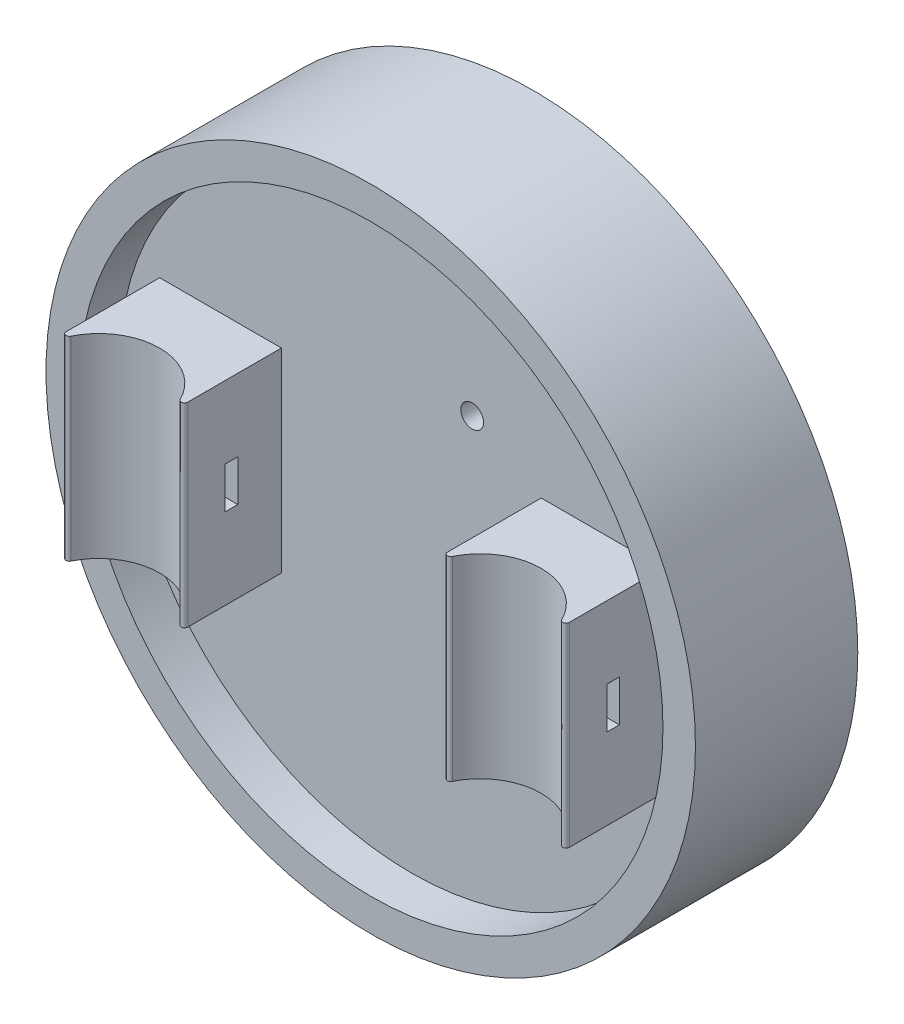
ISO-10303-21;
HEADER;
FILE_DESCRIPTION(('STEP AP214'),'2;1');
FILE_NAME('part.step','',(''),(''),'','','');
FILE_SCHEMA(('AUTOMOTIVE_DESIGN { 1 0 10303 214 1 1 1 1 }'));
ENDSEC;
DATA;
#1=APPLICATION_CONTEXT('core data for automotive mechanical design processes');
#2=APPLICATION_PROTOCOL_DEFINITION('international standard','automotive_design',2000,#1);
#3=PRODUCT_CONTEXT('',#1,'mechanical');
#4=PRODUCT('Part','Part','',(#3));
#5=PRODUCT_RELATED_PRODUCT_CATEGORY('part','',(#4));
#6=PRODUCT_DEFINITION_FORMATION('','',#4);
#7=PRODUCT_DEFINITION_CONTEXT('part definition',#1,'design');
#8=PRODUCT_DEFINITION('design','',#6,#7);
#9=PRODUCT_DEFINITION_SHAPE('','',#8);
#10=(LENGTH_UNIT() NAMED_UNIT(*) SI_UNIT(.MILLI.,.METRE.));
#11=(NAMED_UNIT(*) PLANE_ANGLE_UNIT() SI_UNIT($,.RADIAN.));
#12=(NAMED_UNIT(*) SI_UNIT($,.STERADIAN.) SOLID_ANGLE_UNIT());
#13=UNCERTAINTY_MEASURE_WITH_UNIT(LENGTH_MEASURE(1.E-05),#10,'distance_accuracy_value','');
#14=(GEOMETRIC_REPRESENTATION_CONTEXT(3) GLOBAL_UNCERTAINTY_ASSIGNED_CONTEXT((#13)) GLOBAL_UNIT_ASSIGNED_CONTEXT((#10,
#11,#12)) REPRESENTATION_CONTEXT('',''));
#15=CARTESIAN_POINT('',(0.,0.,0.));
#16=DIRECTION('',(0.,0.,1.));
#17=DIRECTION('',(1.,0.,0.));
#18=AXIS2_PLACEMENT_3D('',#15,#16,#17);
#19=CARTESIAN_POINT('',(0.,0.,0.));
#20=DIRECTION('',(0.,0.,1.));
#21=DIRECTION('',(1.,0.,0.));
#22=AXIS2_PLACEMENT_3D('',#19,#20,#21);
#23=PLANE('',#22);
#24=CARTESIAN_POINT('',(7.5,16.5,0.));
#25=DIRECTION('',(0.,0.,1.));
#26=DIRECTION('',(1.,0.,0.));
#27=AXIS2_PLACEMENT_3D('',#24,#25,#26);
#28=CIRCLE('',#27,1.4);
#29=CARTESIAN_POINT('',(8.9,16.5,0.));
#30=VERTEX_POINT('',#29);
#31=EDGE_CURVE('E535',#30,#30,#28,.T.);
#32=ORIENTED_EDGE('',*,*,#31,.F.);
#33=EDGE_LOOP('',(#32));
#34=FACE_BOUND('',#33,.T.);
#35=CARTESIAN_POINT('',(7.50000000000001,-16.5,0.));
#36=DIRECTION('',(0.,0.,1.));
#37=DIRECTION('',(1.,0.,0.));
#38=AXIS2_PLACEMENT_3D('',#35,#36,#37);
#39=CIRCLE('',#38,1.4);
#40=CARTESIAN_POINT('',(8.90000000000001,-16.5,0.));
#41=VERTEX_POINT('',#40);
#42=EDGE_CURVE('E542',#41,#41,#39,.T.);
#43=ORIENTED_EDGE('',*,*,#42,.F.);
#44=EDGE_LOOP('',(#43));
#45=FACE_BOUND('',#44,.T.);
#46=CARTESIAN_POINT('',(0.,0.,0.));
#47=DIRECTION('',(0.,0.,1.));
#48=DIRECTION('',(1.,0.,0.));
#49=AXIS2_PLACEMENT_3D('',#46,#47,#48);
#50=CIRCLE('',#49,36.);
#51=CARTESIAN_POINT('',(36.,0.,0.));
#52=VERTEX_POINT('',#51);
#53=EDGE_CURVE('E269',#52,#52,#50,.F.);
#54=ORIENTED_EDGE('',*,*,#53,.F.);
#55=EDGE_LOOP('',(#54));
#56=FACE_BOUND('',#55,.T.);
#57=DIRECTION('',(0.,-1.,0.));
#58=VECTOR('',#57,1.);
#59=CARTESIAN_POINT('',(31.,0.,0.));
#60=LINE('',#59,#58);
#61=CARTESIAN_POINT('',(31.,12.,0.));
#62=VERTEX_POINT('',#61);
#63=CARTESIAN_POINT('',(31.,-12.,0.));
#64=VERTEX_POINT('',#63);
#65=EDGE_CURVE('E226',#62,#64,#60,.T.);
#66=ORIENTED_EDGE('',*,*,#65,.T.);
#67=DIRECTION('',(1.,0.,0.));
#68=VECTOR('',#67,1.);
#69=CARTESIAN_POINT('',(0.,-12.,0.));
#70=LINE('',#69,#68);
#71=CARTESIAN_POINT('',(16.,-12.,0.));
#72=VERTEX_POINT('',#71);
#73=EDGE_CURVE('E235',#72,#64,#70,.T.);
#74=ORIENTED_EDGE('',*,*,#73,.F.);
#75=DIRECTION('',(0.,-1.,0.));
#76=VECTOR('',#75,1.);
#77=CARTESIAN_POINT('',(16.,0.,0.));
#78=LINE('',#77,#76);
#79=CARTESIAN_POINT('',(16.,12.,0.));
#80=VERTEX_POINT('',#79);
#81=EDGE_CURVE('E232',#80,#72,#78,.T.);
#82=ORIENTED_EDGE('',*,*,#81,.F.);
#83=DIRECTION('',(1.,0.,0.));
#84=VECTOR('',#83,1.);
#85=CARTESIAN_POINT('',(0.,12.,0.));
#86=LINE('',#85,#84);
#87=EDGE_CURVE('E229',#80,#62,#86,.T.);
#88=ORIENTED_EDGE('',*,*,#87,.T.);
#89=EDGE_LOOP('',(#66,#74,#82,#88));
#90=FACE_BOUND('',#89,.T.);
#91=DIRECTION('',(0.,-1.,0.));
#92=VECTOR('',#91,1.);
#93=CARTESIAN_POINT('',(-16.,0.,0.));
#94=LINE('',#93,#92);
#95=CARTESIAN_POINT('',(-16.,12.,0.));
#96=VERTEX_POINT('',#95);
#97=CARTESIAN_POINT('',(-16.,-12.,0.));
#98=VERTEX_POINT('',#97);
#99=EDGE_CURVE('E246',#96,#98,#94,.T.);
#100=ORIENTED_EDGE('',*,*,#99,.T.);
#101=DIRECTION('',(1.,0.,0.));
#102=VECTOR('',#101,1.);
#103=CARTESIAN_POINT('',(0.,-12.,0.));
#104=LINE('',#103,#102);
#105=CARTESIAN_POINT('',(-31.,-12.,0.));
#106=VERTEX_POINT('',#105);
#107=EDGE_CURVE('E255',#106,#98,#104,.T.);
#108=ORIENTED_EDGE('',*,*,#107,.F.);
#109=DIRECTION('',(0.,-1.,0.));
#110=VECTOR('',#109,1.);
#111=CARTESIAN_POINT('',(-31.,0.,0.));
#112=LINE('',#111,#110);
#113=CARTESIAN_POINT('',(-31.,12.,0.));
#114=VERTEX_POINT('',#113);
#115=EDGE_CURVE('E252',#114,#106,#112,.T.);
#116=ORIENTED_EDGE('',*,*,#115,.F.);
#117=DIRECTION('',(1.,0.,0.));
#118=VECTOR('',#117,1.);
#119=CARTESIAN_POINT('',(0.,12.,0.));
#120=LINE('',#119,#118);
#121=EDGE_CURVE('E249',#114,#96,#120,.T.);
#122=ORIENTED_EDGE('',*,*,#121,.T.);
#123=EDGE_LOOP('',(#100,#108,#116,#122));
#124=FACE_BOUND('',#123,.T.);
#125=ADVANCED_FACE('F33',(#34,#45,#56,#90,#124),#23,.T.);
#126=CARTESIAN_POINT('',(-16.,0.,15.));
#127=DIRECTION('',(1.,0.,0.));
#128=DIRECTION('',(0.,0.,-1.));
#129=AXIS2_PLACEMENT_3D('',#126,#127,#128);
#130=PLANE('',#129);
#131=DIRECTION('',(0.,1.,0.));
#132=VECTOR('',#131,1.);
#133=CARTESIAN_POINT('',(-16.,0.,5.37454204223808));
#134=LINE('',#133,#132);
#135=CARTESIAN_POINT('',(-16.,-2.00914079383873,5.37454204223808));
#136=VERTEX_POINT('',#135);
#137=CARTESIAN_POINT('',(-16.,3.09103892516592,5.37454204223808));
#138=VERTEX_POINT('',#137);
#139=EDGE_CURVE('E206',#136,#138,#134,.T.);
#140=ORIENTED_EDGE('',*,*,#139,.F.);
#141=DIRECTION('',(0.,0.,-1.));
#142=VECTOR('',#141,1.);
#143=CARTESIAN_POINT('',(-16.,-2.00914079383873,15.));
#144=LINE('',#143,#142);
#145=CARTESIAN_POINT('',(-16.,-2.00914079383873,6.922567937299));
#146=VERTEX_POINT('',#145);
#147=EDGE_CURVE('E189',#146,#136,#144,.T.);
#148=ORIENTED_EDGE('',*,*,#147,.F.);
#149=DIRECTION('',(0.,-1.,0.));
#150=VECTOR('',#149,1.);
#151=CARTESIAN_POINT('',(-16.,0.,6.922567937299));
#152=LINE('',#151,#150);
#153=CARTESIAN_POINT('',(-16.,3.09103892516592,6.922567937299));
#154=VERTEX_POINT('',#153);
#155=EDGE_CURVE('E178',#154,#146,#152,.T.);
#156=ORIENTED_EDGE('',*,*,#155,.F.);
#157=DIRECTION('',(0.,0.,1.));
#158=VECTOR('',#157,1.);
#159=CARTESIAN_POINT('',(-16.,3.09103892516592,15.));
#160=LINE('',#159,#158);
#161=EDGE_CURVE('E167',#138,#154,#160,.T.);
#162=ORIENTED_EDGE('',*,*,#161,.F.);
#163=EDGE_LOOP('',(#140,#148,#156,#162));
#164=FACE_BOUND('',#163,.T.);
#165=DIRECTION('',(0.,0.,-1.));
#166=VECTOR('',#165,1.);
#167=CARTESIAN_POINT('',(-16.,12.,15.));
#168=LINE('',#167,#166);
#169=CARTESIAN_POINT('',(-16.,12.,11.5358983848622));
#170=VERTEX_POINT('',#169);
#171=EDGE_CURVE('E264',#170,#96,#168,.T.);
#172=ORIENTED_EDGE('',*,*,#171,.F.);
#173=DIRECTION('',(0.,1.,0.));
#174=VECTOR('',#173,1.);
#175=CARTESIAN_POINT('',(-16.,-12.,11.5358983848622));
#176=LINE('',#175,#174);
#177=CARTESIAN_POINT('',(-16.,-12.,11.5358983848622));
#178=VERTEX_POINT('',#177);
#179=EDGE_CURVE('E290',#170,#178,#176,.F.);
#180=ORIENTED_EDGE('',*,*,#179,.T.);
#181=DIRECTION('',(0.,0.,-1.));
#182=VECTOR('',#181,1.);
#183=CARTESIAN_POINT('',(-16.,-12.,15.));
#184=LINE('',#183,#182);
#185=EDGE_CURVE('E258',#178,#98,#184,.T.);
#186=ORIENTED_EDGE('',*,*,#185,.T.);
#187=ORIENTED_EDGE('',*,*,#99,.F.);
#188=EDGE_LOOP('',(#172,#180,#186,#187));
#189=FACE_BOUND('',#188,.T.);
#190=ADVANCED_FACE('F187',(#164,#189),#130,.T.);
#191=CARTESIAN_POINT('',(0.,12.,15.));
#192=DIRECTION('',(0.,1.,0.));
#193=DIRECTION('',(0.,0.,1.));
#194=AXIS2_PLACEMENT_3D('',#191,#192,#193);
#195=PLANE('',#194);
#196=CARTESIAN_POINT('',(-23.5,12.,15.));
#197=DIRECTION('',(0.,1.,0.));
#198=DIRECTION('',(0.,0.,1.));
#199=AXIS2_PLACEMENT_3D('',#196,#197,#198);
#200=CIRCLE('',#199,7.5);
#201=CARTESIAN_POINT('',(-16.7594936708861,12.,11.7112959349958));
#202=VERTEX_POINT('',#201);
#203=CARTESIAN_POINT('',(-30.2405063291139,12.,11.7112959349958));
#204=VERTEX_POINT('',#203);
#205=EDGE_CURVE('E217',#202,#204,#200,.T.);
#206=ORIENTED_EDGE('',*,*,#205,.F.);
#207=CARTESIAN_POINT('',(-16.4,12.,11.5358983848622));
#208=DIRECTION('',(0.,1.,0.));
#209=DIRECTION('',(0.,0.,1.));
#210=AXIS2_PLACEMENT_3D('',#207,#208,#209);
#211=CIRCLE('',#210,0.4);
#212=EDGE_CURVE('E304',#202,#170,#211,.T.);
#213=ORIENTED_EDGE('',*,*,#212,.T.);
#214=ORIENTED_EDGE('',*,*,#171,.T.);
#215=ORIENTED_EDGE('',*,*,#121,.F.);
#216=DIRECTION('',(0.,0.,-1.));
#217=VECTOR('',#216,1.);
#218=CARTESIAN_POINT('',(-31.,12.,15.));
#219=LINE('',#218,#217);
#220=CARTESIAN_POINT('',(-31.,12.,11.5358983848623));
#221=VERTEX_POINT('',#220);
#222=EDGE_CURVE('E262',#221,#114,#219,.T.);
#223=ORIENTED_EDGE('',*,*,#222,.F.);
#224=CARTESIAN_POINT('',(-30.6,12.,11.5358983848623));
#225=DIRECTION('',(0.,1.,0.));
#226=DIRECTION('',(0.,0.,1.));
#227=AXIS2_PLACEMENT_3D('',#224,#225,#226);
#228=CIRCLE('',#227,0.4);
#229=EDGE_CURVE('E302',#221,#204,#228,.T.);
#230=ORIENTED_EDGE('',*,*,#229,.T.);
#231=EDGE_LOOP('',(#206,#213,#214,#215,#223,#230));
#232=FACE_BOUND('',#231,.T.);
#233=ADVANCED_FACE('F378',(#232),#195,.T.);
#234=CARTESIAN_POINT('',(-31.,0.,15.));
#235=DIRECTION('',(1.,0.,0.));
#236=DIRECTION('',(0.,1.,0.));
#237=AXIS2_PLACEMENT_3D('',#234,#235,#236);
#238=PLANE('',#237);
#239=DIRECTION('',(0.,0.,-1.));
#240=VECTOR('',#239,1.);
#241=CARTESIAN_POINT('',(-31.,-2.00914079383873,15.));
#242=LINE('',#241,#240);
#243=CARTESIAN_POINT('',(-31.,-2.00914079383873,6.922567937299));
#244=VERTEX_POINT('',#243);
#245=CARTESIAN_POINT('',(-31.,-2.00914079383873,5.37454204223808));
#246=VERTEX_POINT('',#245);
#247=EDGE_CURVE('E192',#244,#246,#242,.T.);
#248=ORIENTED_EDGE('',*,*,#247,.T.);
#249=DIRECTION('',(0.,1.,0.));
#250=VECTOR('',#249,1.);
#251=CARTESIAN_POINT('',(-31.,0.,5.37454204223808));
#252=LINE('',#251,#250);
#253=CARTESIAN_POINT('',(-31.,3.09103892516592,5.37454204223808));
#254=VERTEX_POINT('',#253);
#255=EDGE_CURVE('E203',#246,#254,#252,.T.);
#256=ORIENTED_EDGE('',*,*,#255,.T.);
#257=DIRECTION('',(0.,0.,1.));
#258=VECTOR('',#257,1.);
#259=CARTESIAN_POINT('',(-31.,3.09103892516592,15.));
#260=LINE('',#259,#258);
#261=CARTESIAN_POINT('',(-31.,3.09103892516592,6.922567937299));
#262=VERTEX_POINT('',#261);
#263=EDGE_CURVE('E173',#254,#262,#260,.T.);
#264=ORIENTED_EDGE('',*,*,#263,.T.);
#265=DIRECTION('',(0.,-1.,0.));
#266=VECTOR('',#265,1.);
#267=CARTESIAN_POINT('',(-31.,0.,6.922567937299));
#268=LINE('',#267,#266);
#269=EDGE_CURVE('E181',#262,#244,#268,.T.);
#270=ORIENTED_EDGE('',*,*,#269,.T.);
#271=EDGE_LOOP('',(#248,#256,#264,#270));
#272=FACE_BOUND('',#271,.T.);
#273=DIRECTION('',(0.,0.,-1.));
#274=VECTOR('',#273,1.);
#275=CARTESIAN_POINT('',(-31.,-12.,15.));
#276=LINE('',#275,#274);
#277=CARTESIAN_POINT('',(-31.,-12.,11.5358983848623));
#278=VERTEX_POINT('',#277);
#279=EDGE_CURVE('E260',#278,#106,#276,.T.);
#280=ORIENTED_EDGE('',*,*,#279,.F.);
#281=DIRECTION('',(0.,-1.,0.));
#282=VECTOR('',#281,1.);
#283=CARTESIAN_POINT('',(-31.,0.,11.5358983848623));
#284=LINE('',#283,#282);
#285=EDGE_CURVE('E306',#278,#221,#284,.F.);
#286=ORIENTED_EDGE('',*,*,#285,.T.);
#287=ORIENTED_EDGE('',*,*,#222,.T.);
#288=ORIENTED_EDGE('',*,*,#115,.T.);
#289=EDGE_LOOP('',(#280,#286,#287,#288));
#290=FACE_BOUND('',#289,.T.);
#291=ADVANCED_FACE('F342',(#272,#290),#238,.F.);
#292=CARTESIAN_POINT('',(0.,-12.,15.));
#293=DIRECTION('',(0.,1.,0.));
#294=DIRECTION('',(0.,0.,1.));
#295=AXIS2_PLACEMENT_3D('',#292,#293,#294);
#296=PLANE('',#295);
#297=ORIENTED_EDGE('',*,*,#185,.F.);
#298=CARTESIAN_POINT('',(-16.4,-12.,11.5358983848622));
#299=DIRECTION('',(0.,1.,0.));
#300=DIRECTION('',(0.,0.,1.));
#301=AXIS2_PLACEMENT_3D('',#298,#299,#300);
#302=CIRCLE('',#301,0.4);
#303=CARTESIAN_POINT('',(-16.7594936708861,-12.,11.7112959349958));
#304=VERTEX_POINT('',#303);
#305=EDGE_CURVE('E295',#178,#304,#302,.F.);
#306=ORIENTED_EDGE('',*,*,#305,.T.);
#307=CARTESIAN_POINT('',(-23.5,-12.,15.));
#308=DIRECTION('',(0.,1.,0.));
#309=DIRECTION('',(0.,0.,1.));
#310=AXIS2_PLACEMENT_3D('',#307,#308,#309);
#311=CIRCLE('',#310,7.5);
#312=CARTESIAN_POINT('',(-30.2405063291139,-12.,11.7112959349958));
#313=VERTEX_POINT('',#312);
#314=EDGE_CURVE('E214',#304,#313,#311,.T.);
#315=ORIENTED_EDGE('',*,*,#314,.T.);
#316=CARTESIAN_POINT('',(-30.6,-12.,11.5358983848623));
#317=DIRECTION('',(0.,1.,0.));
#318=DIRECTION('',(0.,0.,1.));
#319=AXIS2_PLACEMENT_3D('',#316,#317,#318);
#320=CIRCLE('',#319,0.4);
#321=EDGE_CURVE('E293',#313,#278,#320,.F.);
#322=ORIENTED_EDGE('',*,*,#321,.T.);
#323=ORIENTED_EDGE('',*,*,#279,.T.);
#324=ORIENTED_EDGE('',*,*,#107,.T.);
#325=EDGE_LOOP('',(#297,#306,#315,#322,#323,#324));
#326=FACE_BOUND('',#325,.T.);
#327=ADVANCED_FACE('F421',(#326),#296,.F.);
#328=CARTESIAN_POINT('',(31.,0.,15.));
#329=DIRECTION('',(1.,0.,0.));
#330=DIRECTION('',(0.,1.,0.));
#331=AXIS2_PLACEMENT_3D('',#328,#329,#330);
#332=PLANE('',#331);
#333=DIRECTION('',(0.,1.,0.));
#334=VECTOR('',#333,1.);
#335=CARTESIAN_POINT('',(31.,0.,5.37454204223808));
#336=LINE('',#335,#334);
#337=CARTESIAN_POINT('',(31.,-2.00914079383871,5.37454204223808));
#338=VERTEX_POINT('',#337);
#339=CARTESIAN_POINT('',(31.,3.09103892516594,5.37454204223808));
#340=VERTEX_POINT('',#339);
#341=EDGE_CURVE('E200',#338,#340,#336,.T.);
#342=ORIENTED_EDGE('',*,*,#341,.F.);
#343=DIRECTION('',(0.,0.,-1.));
#344=VECTOR('',#343,1.);
#345=CARTESIAN_POINT('',(31.,-2.00914079383871,15.));
#346=LINE('',#345,#344);
#347=CARTESIAN_POINT('',(31.,-2.00914079383871,6.922567937299));
#348=VERTEX_POINT('',#347);
#349=EDGE_CURVE('E190',#348,#338,#346,.T.);
#350=ORIENTED_EDGE('',*,*,#349,.F.);
#351=DIRECTION('',(0.,-1.,0.));
#352=VECTOR('',#351,1.);
#353=CARTESIAN_POINT('',(31.,0.,6.922567937299));
#354=LINE('',#353,#352);
#355=CARTESIAN_POINT('',(31.,3.09103892516594,6.922567937299));
#356=VERTEX_POINT('',#355);
#357=EDGE_CURVE('E172',#356,#348,#354,.T.);
#358=ORIENTED_EDGE('',*,*,#357,.F.);
#359=DIRECTION('',(0.,0.,1.));
#360=VECTOR('',#359,1.);
#361=CARTESIAN_POINT('',(31.,3.09103892516594,15.));
#362=LINE('',#361,#360);
#363=EDGE_CURVE('E338',#340,#356,#362,.T.);
#364=ORIENTED_EDGE('',*,*,#363,.F.);
#365=EDGE_LOOP('',(#342,#350,#358,#364));
#366=FACE_BOUND('',#365,.T.);
#367=DIRECTION('',(0.,0.,-1.));
#368=VECTOR('',#367,1.);
#369=CARTESIAN_POINT('',(31.,12.,15.));
#370=LINE('',#369,#368);
#371=CARTESIAN_POINT('',(31.,12.,11.5358983848622));
#372=VERTEX_POINT('',#371);
#373=EDGE_CURVE('E244',#372,#62,#370,.T.);
#374=ORIENTED_EDGE('',*,*,#373,.F.);
#375=DIRECTION('',(0.,1.,0.));
#376=VECTOR('',#375,1.);
#377=CARTESIAN_POINT('',(31.,-12.,11.5358983848622));
#378=LINE('',#377,#376);
#379=CARTESIAN_POINT('',(31.,-12.,11.5358983848622));
#380=VERTEX_POINT('',#379);
#381=EDGE_CURVE('E272',#372,#380,#378,.F.);
#382=ORIENTED_EDGE('',*,*,#381,.T.);
#383=DIRECTION('',(0.,0.,-1.));
#384=VECTOR('',#383,1.);
#385=CARTESIAN_POINT('',(31.,-12.,15.));
#386=LINE('',#385,#384);
#387=EDGE_CURVE('E238',#380,#64,#386,.T.);
#388=ORIENTED_EDGE('',*,*,#387,.T.);
#389=ORIENTED_EDGE('',*,*,#65,.F.);
#390=EDGE_LOOP('',(#374,#382,#388,#389));
#391=FACE_BOUND('',#390,.T.);
#392=ADVANCED_FACE('F355',(#366,#391),#332,.T.);
#393=CARTESIAN_POINT('',(0.,12.,15.));
#394=DIRECTION('',(0.,1.,0.));
#395=DIRECTION('',(-1.,0.,0.));
#396=AXIS2_PLACEMENT_3D('',#393,#394,#395);
#397=PLANE('',#396);
#398=CARTESIAN_POINT('',(23.5,12.,15.));
#399=DIRECTION('',(0.,1.,0.));
#400=DIRECTION('',(-1.,0.,0.));
#401=AXIS2_PLACEMENT_3D('',#398,#399,#400);
#402=CIRCLE('',#401,7.5);
#403=CARTESIAN_POINT('',(30.2405063291139,12.,11.7112959349958));
#404=VERTEX_POINT('',#403);
#405=CARTESIAN_POINT('',(16.7594936708861,12.,11.7112959349958));
#406=VERTEX_POINT('',#405);
#407=EDGE_CURVE('E211',#404,#406,#402,.T.);
#408=ORIENTED_EDGE('',*,*,#407,.F.);
#409=CARTESIAN_POINT('',(30.6,12.,11.5358983848622));
#410=DIRECTION('',(0.,1.,0.));
#411=DIRECTION('',(-1.,0.,0.));
#412=AXIS2_PLACEMENT_3D('',#409,#410,#411);
#413=CIRCLE('',#412,0.4);
#414=EDGE_CURVE('E286',#404,#372,#413,.T.);
#415=ORIENTED_EDGE('',*,*,#414,.T.);
#416=ORIENTED_EDGE('',*,*,#373,.T.);
#417=ORIENTED_EDGE('',*,*,#87,.F.);
#418=DIRECTION('',(0.,0.,-1.));
#419=VECTOR('',#418,1.);
#420=CARTESIAN_POINT('',(16.,12.,15.));
#421=LINE('',#420,#419);
#422=CARTESIAN_POINT('',(16.,12.,11.5358983848623));
#423=VERTEX_POINT('',#422);
#424=EDGE_CURVE('E242',#423,#80,#421,.T.);
#425=ORIENTED_EDGE('',*,*,#424,.F.);
#426=CARTESIAN_POINT('',(16.4,12.,11.5358983848623));
#427=DIRECTION('',(0.,1.,0.));
#428=DIRECTION('',(-1.,0.,0.));
#429=AXIS2_PLACEMENT_3D('',#426,#427,#428);
#430=CIRCLE('',#429,0.4);
#431=EDGE_CURVE('E284',#423,#406,#430,.T.);
#432=ORIENTED_EDGE('',*,*,#431,.T.);
#433=EDGE_LOOP('',(#408,#415,#416,#417,#425,#432));
#434=FACE_BOUND('',#433,.T.);
#435=ADVANCED_FACE('F434',(#434),#397,.T.);
#436=CARTESIAN_POINT('',(16.,0.,15.));
#437=DIRECTION('',(1.,0.,0.));
#438=DIRECTION('',(0.,1.,0.));
#439=AXIS2_PLACEMENT_3D('',#436,#437,#438);
#440=PLANE('',#439);
#441=DIRECTION('',(0.,0.,-1.));
#442=VECTOR('',#441,1.);
#443=CARTESIAN_POINT('',(16.,-2.00914079383872,15.));
#444=LINE('',#443,#442);
#445=CARTESIAN_POINT('',(16.,-2.00914079383872,6.922567937299));
#446=VERTEX_POINT('',#445);
#447=CARTESIAN_POINT('',(16.,-2.00914079383872,5.37454204223808));
#448=VERTEX_POINT('',#447);
#449=EDGE_CURVE('E41',#446,#448,#444,.T.);
#450=ORIENTED_EDGE('',*,*,#449,.T.);
#451=DIRECTION('',(0.,1.,0.));
#452=VECTOR('',#451,1.);
#453=CARTESIAN_POINT('',(16.,0.,5.37454204223808));
#454=LINE('',#453,#452);
#455=CARTESIAN_POINT('',(16.,3.09103892516593,5.37454204223808));
#456=VERTEX_POINT('',#455);
#457=EDGE_CURVE('E11',#448,#456,#454,.T.);
#458=ORIENTED_EDGE('',*,*,#457,.T.);
#459=DIRECTION('',(0.,0.,1.));
#460=VECTOR('',#459,1.);
#461=CARTESIAN_POINT('',(16.,3.09103892516593,15.));
#462=LINE('',#461,#460);
#463=CARTESIAN_POINT('',(16.,3.09103892516593,6.922567937299));
#464=VERTEX_POINT('',#463);
#465=EDGE_CURVE('E308',#456,#464,#462,.T.);
#466=ORIENTED_EDGE('',*,*,#465,.T.);
#467=DIRECTION('',(0.,-1.,0.));
#468=VECTOR('',#467,1.);
#469=CARTESIAN_POINT('',(16.,0.,6.922567937299));
#470=LINE('',#469,#468);
#471=EDGE_CURVE('E311',#464,#446,#470,.T.);
#472=ORIENTED_EDGE('',*,*,#471,.T.);
#473=EDGE_LOOP('',(#450,#458,#466,#472));
#474=FACE_BOUND('',#473,.T.);
#475=DIRECTION('',(0.,0.,-1.));
#476=VECTOR('',#475,1.);
#477=CARTESIAN_POINT('',(16.,-12.,15.));
#478=LINE('',#477,#476);
#479=CARTESIAN_POINT('',(16.,-12.,11.5358983848623));
#480=VERTEX_POINT('',#479);
#481=EDGE_CURVE('E240',#480,#72,#478,.T.);
#482=ORIENTED_EDGE('',*,*,#481,.F.);
#483=DIRECTION('',(0.,-1.,0.));
#484=VECTOR('',#483,1.);
#485=CARTESIAN_POINT('',(16.,0.,11.5358983848623));
#486=LINE('',#485,#484);
#487=EDGE_CURVE('E288',#480,#423,#486,.F.);
#488=ORIENTED_EDGE('',*,*,#487,.T.);
#489=ORIENTED_EDGE('',*,*,#424,.T.);
#490=ORIENTED_EDGE('',*,*,#81,.T.);
#491=EDGE_LOOP('',(#482,#488,#489,#490));
#492=FACE_BOUND('',#491,.T.);
#493=ADVANCED_FACE('F315',(#474,#492),#440,.F.);
#494=CARTESIAN_POINT('',(0.,-12.,15.));
#495=DIRECTION('',(0.,1.,0.));
#496=DIRECTION('',(0.,0.,1.));
#497=AXIS2_PLACEMENT_3D('',#494,#495,#496);
#498=PLANE('',#497);
#499=ORIENTED_EDGE('',*,*,#387,.F.);
#500=CARTESIAN_POINT('',(30.6,-12.,11.5358983848622));
#501=DIRECTION('',(0.,1.,0.));
#502=DIRECTION('',(0.,0.,1.));
#503=AXIS2_PLACEMENT_3D('',#500,#501,#502);
#504=CIRCLE('',#503,0.4);
#505=CARTESIAN_POINT('',(30.2405063291139,-12.,11.7112959349958));
#506=VERTEX_POINT('',#505);
#507=EDGE_CURVE('E277',#380,#506,#504,.F.);
#508=ORIENTED_EDGE('',*,*,#507,.T.);
#509=CARTESIAN_POINT('',(23.5,-12.,15.));
#510=DIRECTION('',(0.,1.,0.));
#511=DIRECTION('',(0.,0.,1.));
#512=AXIS2_PLACEMENT_3D('',#509,#510,#511);
#513=CIRCLE('',#512,7.5);
#514=CARTESIAN_POINT('',(16.7594936708861,-12.,11.7112959349958));
#515=VERTEX_POINT('',#514);
#516=EDGE_CURVE('E208',#506,#515,#513,.T.);
#517=ORIENTED_EDGE('',*,*,#516,.T.);
#518=CARTESIAN_POINT('',(16.4,-12.,11.5358983848623));
#519=DIRECTION('',(0.,1.,0.));
#520=DIRECTION('',(0.,0.,1.));
#521=AXIS2_PLACEMENT_3D('',#518,#519,#520);
#522=CIRCLE('',#521,0.4);
#523=EDGE_CURVE('E275',#515,#480,#522,.F.);
#524=ORIENTED_EDGE('',*,*,#523,.T.);
#525=ORIENTED_EDGE('',*,*,#481,.T.);
#526=ORIENTED_EDGE('',*,*,#73,.T.);
#527=EDGE_LOOP('',(#499,#508,#517,#524,#525,#526));
#528=FACE_BOUND('',#527,.T.);
#529=ADVANCED_FACE('F440',(#528),#498,.F.);
#530=CARTESIAN_POINT('',(0.,0.,5.));
#531=DIRECTION('',(0.,0.,-1.));
#532=DIRECTION('',(-1.,0.,0.));
#533=AXIS2_PLACEMENT_3D('',#530,#531,#532);
#534=CYLINDRICAL_SURFACE('',#533,36.);
#535=CARTESIAN_POINT('',(0.,0.,5.));
#536=DIRECTION('',(0.,0.,1.));
#537=DIRECTION('',(1.,0.,0.));
#538=AXIS2_PLACEMENT_3D('',#535,#536,#537);
#539=CIRCLE('',#538,36.);
#540=CARTESIAN_POINT('',(36.,0.,5.));
#541=VERTEX_POINT('',#540);
#542=EDGE_CURVE('E220',#541,#541,#539,.T.);
#543=ORIENTED_EDGE('',*,*,#542,.T.);
#544=EDGE_LOOP('',(#543));
#545=FACE_BOUND('',#544,.T.);
#546=ORIENTED_EDGE('',*,*,#53,.T.);
#547=EDGE_LOOP('',(#546));
#548=FACE_BOUND('',#547,.T.);
#549=ADVANCED_FACE('F443',(#545,#548),#534,.F.);
#550=CARTESIAN_POINT('',(0.,0.,5.));
#551=DIRECTION('',(0.,0.,1.));
#552=DIRECTION('',(1.,0.,0.));
#553=AXIS2_PLACEMENT_3D('',#550,#551,#552);
#554=PLANE('',#553);
#555=ORIENTED_EDGE('',*,*,#542,.F.);
#556=EDGE_LOOP('',(#555));
#557=FACE_BOUND('',#556,.T.);
#558=CARTESIAN_POINT('',(0.,0.,5.));
#559=DIRECTION('',(0.,0.,1.));
#560=DIRECTION('',(1.,0.,0.));
#561=AXIS2_PLACEMENT_3D('',#558,#559,#560);
#562=CIRCLE('',#561,40.);
#563=CARTESIAN_POINT('',(40.,0.,5.));
#564=VERTEX_POINT('',#563);
#565=EDGE_CURVE('E223',#564,#564,#562,.T.);
#566=ORIENTED_EDGE('',*,*,#565,.T.);
#567=EDGE_LOOP('',(#566));
#568=FACE_BOUND('',#567,.T.);
#569=ADVANCED_FACE('F447',(#557,#568),#554,.T.);
#570=CARTESIAN_POINT('',(0.,0.,-15.));
#571=DIRECTION('',(0.,0.,1.));
#572=DIRECTION('',(1.,0.,0.));
#573=AXIS2_PLACEMENT_3D('',#570,#571,#572);
#574=PLANE('',#573);
#575=CARTESIAN_POINT('',(0.,0.,-15.));
#576=DIRECTION('',(0.,0.,1.));
#577=DIRECTION('',(1.,0.,0.));
#578=AXIS2_PLACEMENT_3D('',#575,#576,#577);
#579=CIRCLE('',#578,40.);
#580=CARTESIAN_POINT('',(40.,0.,-15.));
#581=VERTEX_POINT('',#580);
#582=EDGE_CURVE('E266',#581,#581,#579,.T.);
#583=ORIENTED_EDGE('',*,*,#582,.F.);
#584=EDGE_LOOP('',(#583));
#585=FACE_BOUND('',#584,.T.);
#586=ADVANCED_FACE('F384',(#585),#574,.F.);
#587=CARTESIAN_POINT('',(0.,0.,-15.));
#588=DIRECTION('',(0.,0.,1.));
#589=DIRECTION('',(1.,0.,0.));
#590=AXIS2_PLACEMENT_3D('',#587,#588,#589);
#591=CYLINDRICAL_SURFACE('',#590,40.);
#592=ORIENTED_EDGE('',*,*,#582,.T.);
#593=EDGE_LOOP('',(#592));
#594=FACE_BOUND('',#593,.T.);
#595=ORIENTED_EDGE('',*,*,#565,.F.);
#596=EDGE_LOOP('',(#595));
#597=FACE_BOUND('',#596,.T.);
#598=ADVANCED_FACE('F385',(#594,#597),#591,.T.);
#599=CARTESIAN_POINT('',(23.5,40.,15.));
#600=DIRECTION('',(0.,-1.,0.));
#601=DIRECTION('',(0.,0.,-1.));
#602=AXIS2_PLACEMENT_3D('',#599,#600,#601);
#603=CYLINDRICAL_SURFACE('',#602,7.5);
#604=ORIENTED_EDGE('',*,*,#516,.F.);
#605=DIRECTION('',(0.,-1.,0.));
#606=VECTOR('',#605,1.);
#607=CARTESIAN_POINT('',(30.2405063291139,40.,11.7112959349958));
#608=LINE('',#607,#606);
#609=EDGE_CURVE('E282',#506,#404,#608,.F.);
#610=ORIENTED_EDGE('',*,*,#609,.T.);
#611=ORIENTED_EDGE('',*,*,#407,.T.);
#612=DIRECTION('',(0.,-1.,0.));
#613=VECTOR('',#612,1.);
#614=CARTESIAN_POINT('',(16.7594936708861,40.,11.7112959349958));
#615=LINE('',#614,#613);
#616=EDGE_CURVE('E279',#406,#515,#615,.T.);
#617=ORIENTED_EDGE('',*,*,#616,.T.);
#618=EDGE_LOOP('',(#604,#610,#611,#617));
#619=FACE_BOUND('',#618,.T.);
#620=ADVANCED_FACE('F388',(#619),#603,.F.);
#621=CARTESIAN_POINT('',(-23.5,40.,15.));
#622=DIRECTION('',(0.,-1.,0.));
#623=DIRECTION('',(0.,0.,-1.));
#624=AXIS2_PLACEMENT_3D('',#621,#622,#623);
#625=CYLINDRICAL_SURFACE('',#624,7.5);
#626=ORIENTED_EDGE('',*,*,#314,.F.);
#627=DIRECTION('',(0.,-1.,0.));
#628=VECTOR('',#627,1.);
#629=CARTESIAN_POINT('',(-16.7594936708861,40.,11.7112959349958));
#630=LINE('',#629,#628);
#631=EDGE_CURVE('E300',#304,#202,#630,.F.);
#632=ORIENTED_EDGE('',*,*,#631,.T.);
#633=ORIENTED_EDGE('',*,*,#205,.T.);
#634=DIRECTION('',(0.,-1.,0.));
#635=VECTOR('',#634,1.);
#636=CARTESIAN_POINT('',(-30.2405063291139,40.,11.7112959349958));
#637=LINE('',#636,#635);
#638=EDGE_CURVE('E297',#204,#313,#637,.T.);
#639=ORIENTED_EDGE('',*,*,#638,.T.);
#640=EDGE_LOOP('',(#626,#632,#633,#639));
#641=FACE_BOUND('',#640,.T.);
#642=ADVANCED_FACE('F394',(#641),#625,.F.);
#643=CARTESIAN_POINT('',(30.6,40.,11.5358983848622));
#644=DIRECTION('',(0.,-1.,0.));
#645=DIRECTION('',(0.,0.,-1.));
#646=AXIS2_PLACEMENT_3D('',#643,#644,#645);
#647=CYLINDRICAL_SURFACE('',#646,0.4);
#648=ORIENTED_EDGE('',*,*,#414,.F.);
#649=ORIENTED_EDGE('',*,*,#609,.F.);
#650=ORIENTED_EDGE('',*,*,#507,.F.);
#651=ORIENTED_EDGE('',*,*,#381,.F.);
#652=EDGE_LOOP('',(#648,#649,#650,#651));
#653=FACE_BOUND('',#652,.T.);
#654=ADVANCED_FACE('F390',(#653),#647,.T.);
#655=CARTESIAN_POINT('',(16.4,40.,11.5358983848623));
#656=DIRECTION('',(0.,-1.,0.));
#657=DIRECTION('',(0.,0.,-1.));
#658=AXIS2_PLACEMENT_3D('',#655,#656,#657);
#659=CYLINDRICAL_SURFACE('',#658,0.4);
#660=ORIENTED_EDGE('',*,*,#431,.F.);
#661=ORIENTED_EDGE('',*,*,#487,.F.);
#662=ORIENTED_EDGE('',*,*,#523,.F.);
#663=ORIENTED_EDGE('',*,*,#616,.F.);
#664=EDGE_LOOP('',(#660,#661,#662,#663));
#665=FACE_BOUND('',#664,.T.);
#666=ADVANCED_FACE('F393',(#665),#659,.T.);
#667=CARTESIAN_POINT('',(-16.4,40.,11.5358983848622));
#668=DIRECTION('',(0.,-1.,0.));
#669=DIRECTION('',(0.,0.,-1.));
#670=AXIS2_PLACEMENT_3D('',#667,#668,#669);
#671=CYLINDRICAL_SURFACE('',#670,0.4);
#672=ORIENTED_EDGE('',*,*,#212,.F.);
#673=ORIENTED_EDGE('',*,*,#631,.F.);
#674=ORIENTED_EDGE('',*,*,#305,.F.);
#675=ORIENTED_EDGE('',*,*,#179,.F.);
#676=EDGE_LOOP('',(#672,#673,#674,#675));
#677=FACE_BOUND('',#676,.T.);
#678=ADVANCED_FACE('F366',(#677),#671,.T.);
#679=CARTESIAN_POINT('',(-30.6,40.,11.5358983848623));
#680=DIRECTION('',(0.,-1.,0.));
#681=DIRECTION('',(0.,0.,-1.));
#682=AXIS2_PLACEMENT_3D('',#679,#680,#681);
#683=CYLINDRICAL_SURFACE('',#682,0.4);
#684=ORIENTED_EDGE('',*,*,#229,.F.);
#685=ORIENTED_EDGE('',*,*,#285,.F.);
#686=ORIENTED_EDGE('',*,*,#321,.F.);
#687=ORIENTED_EDGE('',*,*,#638,.F.);
#688=EDGE_LOOP('',(#684,#685,#686,#687));
#689=FACE_BOUND('',#688,.T.);
#690=ADVANCED_FACE('F35',(#689),#683,.T.);
#691=CARTESIAN_POINT('',(-40.,3.09103892516592,6.922567937299));
#692=DIRECTION('',(0.,1.,0.));
#693=DIRECTION('',(-1.,0.,0.));
#694=AXIS2_PLACEMENT_3D('',#691,#692,#693);
#695=PLANE('',#694);
#696=ORIENTED_EDGE('',*,*,#363,.T.);
#697=DIRECTION('',(1.,0.,0.));
#698=VECTOR('',#697,1.);
#699=CARTESIAN_POINT('',(-40.,3.09103892516592,6.922567937299));
#700=LINE('',#699,#698);
#701=EDGE_CURVE('E184',#464,#356,#700,.T.);
#702=ORIENTED_EDGE('',*,*,#701,.F.);
#703=ORIENTED_EDGE('',*,*,#465,.F.);
#704=DIRECTION('',(1.,0.,0.));
#705=VECTOR('',#704,1.);
#706=CARTESIAN_POINT('',(-40.,3.09103892516592,5.37454204223808));
#707=LINE('',#706,#705);
#708=EDGE_CURVE('E335',#456,#340,#707,.T.);
#709=ORIENTED_EDGE('',*,*,#708,.T.);
#710=EDGE_LOOP('',(#696,#702,#703,#709));
#711=FACE_BOUND('',#710,.T.);
#712=ADVANCED_FACE('F358',(#711),#695,.F.);
#713=CARTESIAN_POINT('',(-40.,3.09103892516592,6.922567937299));
#714=DIRECTION('',(0.,0.,1.));
#715=DIRECTION('',(1.,0.,0.));
#716=AXIS2_PLACEMENT_3D('',#713,#714,#715);
#717=PLANE('',#716);
#718=ORIENTED_EDGE('',*,*,#357,.T.);
#719=DIRECTION('',(1.,0.,0.));
#720=VECTOR('',#719,1.);
#721=CARTESIAN_POINT('',(-40.,-2.00914079383873,6.922567937299));
#722=LINE('',#721,#720);
#723=EDGE_CURVE('E183',#446,#348,#722,.T.);
#724=ORIENTED_EDGE('',*,*,#723,.F.);
#725=ORIENTED_EDGE('',*,*,#471,.F.);
#726=ORIENTED_EDGE('',*,*,#701,.T.);
#727=EDGE_LOOP('',(#718,#724,#725,#726));
#728=FACE_BOUND('',#727,.T.);
#729=ADVANCED_FACE('F327',(#728),#717,.F.);
#730=CARTESIAN_POINT('',(-40.,-2.00914079383873,6.922567937299));
#731=DIRECTION('',(0.,-1.,0.));
#732=DIRECTION('',(1.,0.,0.));
#733=AXIS2_PLACEMENT_3D('',#730,#731,#732);
#734=PLANE('',#733);
#735=ORIENTED_EDGE('',*,*,#349,.T.);
#736=DIRECTION('',(1.,0.,0.));
#737=VECTOR('',#736,1.);
#738=CARTESIAN_POINT('',(-40.,-2.00914079383873,5.37454204223808));
#739=LINE('',#738,#737);
#740=EDGE_CURVE('E325',#448,#338,#739,.T.);
#741=ORIENTED_EDGE('',*,*,#740,.F.);
#742=ORIENTED_EDGE('',*,*,#449,.F.);
#743=ORIENTED_EDGE('',*,*,#723,.T.);
#744=EDGE_LOOP('',(#735,#741,#742,#743));
#745=FACE_BOUND('',#744,.T.);
#746=ADVANCED_FACE('F322',(#745),#734,.F.);
#747=CARTESIAN_POINT('',(-40.,3.09103892516592,5.37454204223808));
#748=DIRECTION('',(0.,0.,-1.));
#749=DIRECTION('',(-1.,0.,0.));
#750=AXIS2_PLACEMENT_3D('',#747,#748,#749);
#751=PLANE('',#750);
#752=ORIENTED_EDGE('',*,*,#341,.T.);
#753=ORIENTED_EDGE('',*,*,#708,.F.);
#754=ORIENTED_EDGE('',*,*,#457,.F.);
#755=ORIENTED_EDGE('',*,*,#740,.T.);
#756=EDGE_LOOP('',(#752,#753,#754,#755));
#757=FACE_BOUND('',#756,.T.);
#758=ADVANCED_FACE('F351',(#757),#751,.F.);
#759=ORIENTED_EDGE('',*,*,#139,.T.);
#760=EDGE_CURVE('E48',#254,#138,#707,.T.);
#761=ORIENTED_EDGE('',*,*,#760,.F.);
#762=ORIENTED_EDGE('',*,*,#255,.F.);
#763=EDGE_CURVE('E340',#246,#136,#739,.T.);
#764=ORIENTED_EDGE('',*,*,#763,.T.);
#765=EDGE_LOOP('',(#759,#761,#762,#764));
#766=FACE_BOUND('',#765,.T.);
#767=ADVANCED_FACE('F345',(#766),#751,.F.);
#768=ORIENTED_EDGE('',*,*,#147,.T.);
#769=ORIENTED_EDGE('',*,*,#763,.F.);
#770=ORIENTED_EDGE('',*,*,#247,.F.);
#771=EDGE_CURVE('E330',#244,#146,#722,.T.);
#772=ORIENTED_EDGE('',*,*,#771,.T.);
#773=EDGE_LOOP('',(#768,#769,#770,#772));
#774=FACE_BOUND('',#773,.T.);
#775=ADVANCED_FACE('F457',(#774),#734,.F.);
#776=ORIENTED_EDGE('',*,*,#155,.T.);
#777=ORIENTED_EDGE('',*,*,#771,.F.);
#778=ORIENTED_EDGE('',*,*,#269,.F.);
#779=EDGE_CURVE('E53',#262,#154,#700,.T.);
#780=ORIENTED_EDGE('',*,*,#779,.T.);
#781=EDGE_LOOP('',(#776,#777,#778,#780));
#782=FACE_BOUND('',#781,.T.);
#783=ADVANCED_FACE('F176',(#782),#717,.F.);
#784=ORIENTED_EDGE('',*,*,#161,.T.);
#785=ORIENTED_EDGE('',*,*,#779,.F.);
#786=ORIENTED_EDGE('',*,*,#263,.F.);
#787=ORIENTED_EDGE('',*,*,#760,.T.);
#788=EDGE_LOOP('',(#784,#785,#786,#787));
#789=FACE_BOUND('',#788,.T.);
#790=ADVANCED_FACE('F168',(#789),#695,.F.);
#791=CARTESIAN_POINT('',(7.50000000000001,-16.5,-5.));
#792=DIRECTION('',(0.,0.,1.));
#793=DIRECTION('',(1.,0.,0.));
#794=AXIS2_PLACEMENT_3D('',#791,#792,#793);
#795=CYLINDRICAL_SURFACE('',#794,1.4);
#796=CARTESIAN_POINT('',(7.50000000000001,-16.5,-5.));
#797=DIRECTION('',(0.,0.,1.));
#798=DIRECTION('',(1.,0.,0.));
#799=AXIS2_PLACEMENT_3D('',#796,#797,#798);
#800=CIRCLE('',#799,1.4);
#801=CARTESIAN_POINT('',(8.90000000000001,-16.5,-5.));
#802=VERTEX_POINT('',#801);
#803=EDGE_CURVE('E538',#802,#802,#800,.T.);
#804=ORIENTED_EDGE('',*,*,#803,.F.);
#805=EDGE_LOOP('',(#804));
#806=FACE_BOUND('',#805,.T.);
#807=ORIENTED_EDGE('',*,*,#42,.T.);
#808=EDGE_LOOP('',(#807));
#809=FACE_BOUND('',#808,.T.);
#810=ADVANCED_FACE('F370',(#806,#809),#795,.F.);
#811=CARTESIAN_POINT('',(0.,0.,-5.));
#812=DIRECTION('',(0.,0.,1.));
#813=DIRECTION('',(1.,0.,0.));
#814=AXIS2_PLACEMENT_3D('',#811,#812,#813);
#815=PLANE('',#814);
#816=ORIENTED_EDGE('',*,*,#803,.T.);
#817=EDGE_LOOP('',(#816));
#818=FACE_BOUND('',#817,.T.);
#819=ADVANCED_FACE('F493',(#818),#815,.T.);
#820=CARTESIAN_POINT('',(7.5,16.5,-5.));
#821=DIRECTION('',(0.,0.,1.));
#822=DIRECTION('',(1.,0.,0.));
#823=AXIS2_PLACEMENT_3D('',#820,#821,#822);
#824=CYLINDRICAL_SURFACE('',#823,1.4);
#825=CARTESIAN_POINT('',(7.5,16.5,-5.));
#826=DIRECTION('',(0.,0.,1.));
#827=DIRECTION('',(1.,0.,0.));
#828=AXIS2_PLACEMENT_3D('',#825,#826,#827);
#829=CIRCLE('',#828,1.4);
#830=CARTESIAN_POINT('',(8.9,16.5,-5.));
#831=VERTEX_POINT('',#830);
#832=EDGE_CURVE('E337',#831,#831,#829,.T.);
#833=ORIENTED_EDGE('',*,*,#832,.F.);
#834=EDGE_LOOP('',(#833));
#835=FACE_BOUND('',#834,.T.);
#836=ORIENTED_EDGE('',*,*,#31,.T.);
#837=EDGE_LOOP('',(#836));
#838=FACE_BOUND('',#837,.T.);
#839=ADVANCED_FACE('F503',(#835,#838),#824,.F.);
#840=CARTESIAN_POINT('',(0.,0.,-5.));
#841=DIRECTION('',(0.,0.,1.));
#842=DIRECTION('',(1.,0.,0.));
#843=AXIS2_PLACEMENT_3D('',#840,#841,#842);
#844=PLANE('',#843);
#845=ORIENTED_EDGE('',*,*,#832,.T.);
#846=EDGE_LOOP('',(#845));
#847=FACE_BOUND('',#846,.T.);
#848=ADVANCED_FACE('F513',(#847),#844,.T.);
#849=CLOSED_SHELL('',(#125,#190,#233,#291,#327,#392,#435,#493,#529,#549,#569,#586,#598,#620,
#642,#654,#666,#678,#690,#712,#729,#746,#758,#767,#775,#783,#790,#810,#819,#839,#848));
#850=MANIFOLD_SOLID_BREP('B2',#849);
#851=ADVANCED_BREP_SHAPE_REPRESENTATION('',(#18,#850),#14);
#852=SHAPE_DEFINITION_REPRESENTATION(#9,#851);
ENDSEC;
END-ISO-10303-21;
